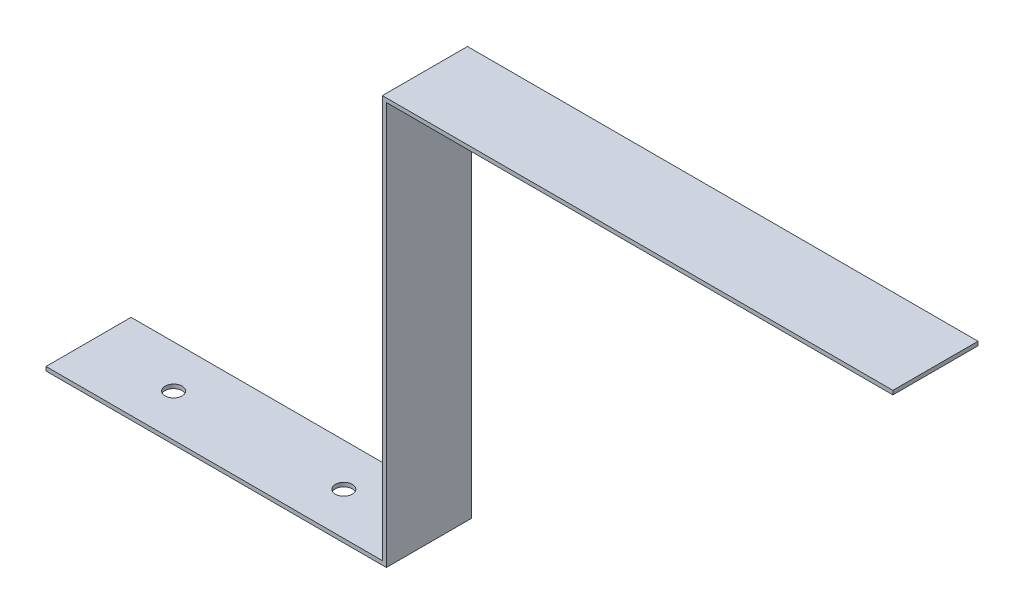
ISO-10303-21;
HEADER;
FILE_DESCRIPTION(('STEP AP214'),'2;1');
FILE_NAME('part.step','',(''),(''),'','','');
FILE_SCHEMA(('AUTOMOTIVE_DESIGN { 1 0 10303 214 1 1 1 1 }'));
ENDSEC;
DATA;
#1=APPLICATION_CONTEXT('core data for automotive mechanical design processes');
#2=APPLICATION_PROTOCOL_DEFINITION('international standard','automotive_design',2000,#1);
#3=PRODUCT_CONTEXT('',#1,'mechanical');
#4=PRODUCT('Part','Part','',(#3));
#5=PRODUCT_RELATED_PRODUCT_CATEGORY('part','',(#4));
#6=PRODUCT_DEFINITION_FORMATION('','',#4);
#7=PRODUCT_DEFINITION_CONTEXT('part definition',#1,'design');
#8=PRODUCT_DEFINITION('design','',#6,#7);
#9=PRODUCT_DEFINITION_SHAPE('','',#8);
#10=(LENGTH_UNIT() NAMED_UNIT(*) SI_UNIT(.MILLI.,.METRE.));
#11=(NAMED_UNIT(*) PLANE_ANGLE_UNIT() SI_UNIT($,.RADIAN.));
#12=(NAMED_UNIT(*) SI_UNIT($,.STERADIAN.) SOLID_ANGLE_UNIT());
#13=UNCERTAINTY_MEASURE_WITH_UNIT(LENGTH_MEASURE(1.E-05),#10,'distance_accuracy_value','');
#14=(GEOMETRIC_REPRESENTATION_CONTEXT(3) GLOBAL_UNCERTAINTY_ASSIGNED_CONTEXT((#13)) GLOBAL_UNIT_ASSIGNED_CONTEXT((#10,
#11,#12)) REPRESENTATION_CONTEXT('',''));
#15=CARTESIAN_POINT('',(0.,0.,0.));
#16=DIRECTION('',(0.,0.,1.));
#17=DIRECTION('',(1.,0.,0.));
#18=AXIS2_PLACEMENT_3D('',#15,#16,#17);
#19=CARTESIAN_POINT('',(0.,0.69999999999999,15.));
#20=DIRECTION('',(1.,0.,0.));
#21=DIRECTION('',(0.,1.,0.));
#22=AXIS2_PLACEMENT_3D('',#19,#20,#21);
#23=PLANE('',#22);
#24=DIRECTION('',(0.,-1.,0.));
#25=VECTOR('',#24,1.);
#26=CARTESIAN_POINT('',(0.,0.69999999999999,0.));
#27=LINE('',#26,#25);
#28=CARTESIAN_POINT('',(0.,0.69999999999999,0.));
#29=VERTEX_POINT('',#28);
#30=CARTESIAN_POINT('',(0.,0.,0.));
#31=VERTEX_POINT('',#30);
#32=EDGE_CURVE('E140',#29,#31,#27,.T.);
#33=ORIENTED_EDGE('',*,*,#32,.T.);
#34=DIRECTION('',(0.,0.,-1.));
#35=VECTOR('',#34,1.);
#36=CARTESIAN_POINT('',(0.,0.,15.));
#37=LINE('',#36,#35);
#38=CARTESIAN_POINT('',(0.,0.,15.));
#39=VERTEX_POINT('',#38);
#40=EDGE_CURVE('E11',#39,#31,#37,.T.);
#41=ORIENTED_EDGE('',*,*,#40,.F.);
#42=DIRECTION('',(0.,-1.,0.));
#43=VECTOR('',#42,1.);
#44=CARTESIAN_POINT('',(0.,0.69999999999999,15.));
#45=LINE('',#44,#43);
#46=CARTESIAN_POINT('',(0.,0.69999999999999,15.));
#47=VERTEX_POINT('',#46);
#48=EDGE_CURVE('E163',#47,#39,#45,.T.);
#49=ORIENTED_EDGE('',*,*,#48,.F.);
#50=DIRECTION('',(0.,0.,-1.));
#51=VECTOR('',#50,1.);
#52=CARTESIAN_POINT('',(0.,0.69999999999999,15.));
#53=LINE('',#52,#51);
#54=EDGE_CURVE('E136',#47,#29,#53,.T.);
#55=ORIENTED_EDGE('',*,*,#54,.T.);
#56=EDGE_LOOP('',(#33,#41,#49,#55));
#57=FACE_BOUND('',#56,.T.);
#58=ADVANCED_FACE('F39',(#57),#23,.F.);
#59=CARTESIAN_POINT('',(0.,0.,15.));
#60=DIRECTION('',(0.,1.,0.));
#61=DIRECTION('',(0.,0.,1.));
#62=AXIS2_PLACEMENT_3D('',#59,#60,#61);
#63=PLANE('',#62);
#64=CARTESIAN_POINT('',(15.,0.,7.5));
#65=DIRECTION('',(0.,1.,0.));
#66=DIRECTION('',(-1.,0.,0.));
#67=AXIS2_PLACEMENT_3D('',#64,#65,#66);
#68=CIRCLE('',#67,1.5);
#69=CARTESIAN_POINT('',(13.5,0.,7.5));
#70=VERTEX_POINT('',#69);
#71=EDGE_CURVE('E145',#70,#70,#68,.T.);
#72=ORIENTED_EDGE('',*,*,#71,.T.);
#73=EDGE_LOOP('',(#72));
#74=FACE_BOUND('',#73,.T.);
#75=CARTESIAN_POINT('',(45.,0.,7.5));
#76=DIRECTION('',(0.,1.,0.));
#77=DIRECTION('',(-1.,0.,0.));
#78=AXIS2_PLACEMENT_3D('',#75,#76,#77);
#79=CIRCLE('',#78,1.5);
#80=CARTESIAN_POINT('',(43.5,0.,7.5));
#81=VERTEX_POINT('',#80);
#82=EDGE_CURVE('E211',#81,#81,#79,.T.);
#83=ORIENTED_EDGE('',*,*,#82,.T.);
#84=EDGE_LOOP('',(#83));
#85=FACE_BOUND('',#84,.T.);
#86=DIRECTION('',(1.,0.,0.));
#87=VECTOR('',#86,1.);
#88=CARTESIAN_POINT('',(0.,0.,0.));
#89=LINE('',#88,#87);
#90=CARTESIAN_POINT('',(60.,0.,0.));
#91=VERTEX_POINT('',#90);
#92=EDGE_CURVE('E144',#31,#91,#89,.T.);
#93=ORIENTED_EDGE('',*,*,#92,.T.);
#94=DIRECTION('',(0.,0.,-1.));
#95=VECTOR('',#94,1.);
#96=CARTESIAN_POINT('',(60.,0.,15.));
#97=LINE('',#96,#95);
#98=CARTESIAN_POINT('',(60.,0.,15.));
#99=VERTEX_POINT('',#98);
#100=EDGE_CURVE('E48',#99,#91,#97,.T.);
#101=ORIENTED_EDGE('',*,*,#100,.F.);
#102=DIRECTION('',(1.,0.,0.));
#103=VECTOR('',#102,1.);
#104=CARTESIAN_POINT('',(0.,0.,15.));
#105=LINE('',#104,#103);
#106=EDGE_CURVE('E99',#39,#99,#105,.T.);
#107=ORIENTED_EDGE('',*,*,#106,.F.);
#108=ORIENTED_EDGE('',*,*,#40,.T.);
#109=EDGE_LOOP('',(#93,#101,#107,#108));
#110=FACE_BOUND('',#109,.T.);
#111=ADVANCED_FACE('F223',(#74,#85,#110),#63,.F.);
#112=CARTESIAN_POINT('',(60.,0.,15.));
#113=DIRECTION('',(-1.,0.,0.));
#114=DIRECTION('',(0.,0.,1.));
#115=AXIS2_PLACEMENT_3D('',#112,#113,#114);
#116=PLANE('',#115);
#117=DIRECTION('',(0.,1.,0.));
#118=VECTOR('',#117,1.);
#119=CARTESIAN_POINT('',(60.,0.,0.));
#120=LINE('',#119,#118);
#121=CARTESIAN_POINT('',(60.,71.,0.));
#122=VERTEX_POINT('',#121);
#123=EDGE_CURVE('E148',#91,#122,#120,.T.);
#124=ORIENTED_EDGE('',*,*,#123,.T.);
#125=DIRECTION('',(0.,0.,-1.));
#126=VECTOR('',#125,1.);
#127=CARTESIAN_POINT('',(60.,71.,15.));
#128=LINE('',#127,#126);
#129=CARTESIAN_POINT('',(60.,71.,15.));
#130=VERTEX_POINT('',#129);
#131=EDGE_CURVE('E174',#130,#122,#128,.T.);
#132=ORIENTED_EDGE('',*,*,#131,.F.);
#133=DIRECTION('',(0.,1.,0.));
#134=VECTOR('',#133,1.);
#135=CARTESIAN_POINT('',(60.,0.,15.));
#136=LINE('',#135,#134);
#137=EDGE_CURVE('E184',#99,#130,#136,.T.);
#138=ORIENTED_EDGE('',*,*,#137,.F.);
#139=ORIENTED_EDGE('',*,*,#100,.T.);
#140=EDGE_LOOP('',(#124,#132,#138,#139));
#141=FACE_BOUND('',#140,.T.);
#142=ADVANCED_FACE('F182',(#141),#116,.F.);
#143=CARTESIAN_POINT('',(60.,71.,15.));
#144=DIRECTION('',(0.,1.,0.));
#145=DIRECTION('',(0.,0.,1.));
#146=AXIS2_PLACEMENT_3D('',#143,#144,#145);
#147=PLANE('',#146);
#148=DIRECTION('',(1.,0.,0.));
#149=VECTOR('',#148,1.);
#150=CARTESIAN_POINT('',(60.,71.,0.));
#151=LINE('',#150,#149);
#152=CARTESIAN_POINT('',(149.3,71.,0.));
#153=VERTEX_POINT('',#152);
#154=EDGE_CURVE('E151',#122,#153,#151,.T.);
#155=ORIENTED_EDGE('',*,*,#154,.T.);
#156=DIRECTION('',(0.,0.,-1.));
#157=VECTOR('',#156,1.);
#158=CARTESIAN_POINT('',(149.3,71.,15.));
#159=LINE('',#158,#157);
#160=CARTESIAN_POINT('',(149.3,71.,15.));
#161=VERTEX_POINT('',#160);
#162=EDGE_CURVE('E170',#161,#153,#159,.T.);
#163=ORIENTED_EDGE('',*,*,#162,.F.);
#164=DIRECTION('',(1.,0.,0.));
#165=VECTOR('',#164,1.);
#166=CARTESIAN_POINT('',(60.,71.,15.));
#167=LINE('',#166,#165);
#168=EDGE_CURVE('E197',#130,#161,#167,.T.);
#169=ORIENTED_EDGE('',*,*,#168,.F.);
#170=ORIENTED_EDGE('',*,*,#131,.T.);
#171=EDGE_LOOP('',(#155,#163,#169,#170));
#172=FACE_BOUND('',#171,.T.);
#173=ADVANCED_FACE('F192',(#172),#147,.F.);
#174=CARTESIAN_POINT('',(149.3,71.,15.));
#175=DIRECTION('',(-1.,0.,0.));
#176=DIRECTION('',(0.,0.,1.));
#177=AXIS2_PLACEMENT_3D('',#174,#175,#176);
#178=PLANE('',#177);
#179=DIRECTION('',(0.,1.,0.));
#180=VECTOR('',#179,1.);
#181=CARTESIAN_POINT('',(149.3,71.,0.));
#182=LINE('',#181,#180);
#183=CARTESIAN_POINT('',(149.3,71.7,0.));
#184=VERTEX_POINT('',#183);
#185=EDGE_CURVE('E154',#153,#184,#182,.T.);
#186=ORIENTED_EDGE('',*,*,#185,.T.);
#187=DIRECTION('',(0.,0.,-1.));
#188=VECTOR('',#187,1.);
#189=CARTESIAN_POINT('',(149.3,71.7,15.));
#190=LINE('',#189,#188);
#191=CARTESIAN_POINT('',(149.3,71.7,15.));
#192=VERTEX_POINT('',#191);
#193=EDGE_CURVE('E129',#192,#184,#190,.T.);
#194=ORIENTED_EDGE('',*,*,#193,.F.);
#195=DIRECTION('',(0.,1.,0.));
#196=VECTOR('',#195,1.);
#197=CARTESIAN_POINT('',(149.3,71.,15.));
#198=LINE('',#197,#196);
#199=EDGE_CURVE('E118',#161,#192,#198,.T.);
#200=ORIENTED_EDGE('',*,*,#199,.F.);
#201=ORIENTED_EDGE('',*,*,#162,.T.);
#202=EDGE_LOOP('',(#186,#194,#200,#201));
#203=FACE_BOUND('',#202,.T.);
#204=ADVANCED_FACE('F195',(#203),#178,.F.);
#205=CARTESIAN_POINT('',(149.3,71.7,15.));
#206=DIRECTION('',(0.,-1.,0.));
#207=DIRECTION('',(1.,0.,0.));
#208=AXIS2_PLACEMENT_3D('',#205,#206,#207);
#209=PLANE('',#208);
#210=DIRECTION('',(-1.,0.,0.));
#211=VECTOR('',#210,1.);
#212=CARTESIAN_POINT('',(149.3,71.7,0.));
#213=LINE('',#212,#211);
#214=CARTESIAN_POINT('',(59.3,71.7,0.));
#215=VERTEX_POINT('',#214);
#216=EDGE_CURVE('E127',#184,#215,#213,.T.);
#217=ORIENTED_EDGE('',*,*,#216,.T.);
#218=DIRECTION('',(0.,0.,-1.));
#219=VECTOR('',#218,1.);
#220=CARTESIAN_POINT('',(59.3,71.7,15.));
#221=LINE('',#220,#219);
#222=CARTESIAN_POINT('',(59.3,71.7,15.));
#223=VERTEX_POINT('',#222);
#224=EDGE_CURVE('E124',#223,#215,#221,.T.);
#225=ORIENTED_EDGE('',*,*,#224,.F.);
#226=DIRECTION('',(-1.,0.,0.));
#227=VECTOR('',#226,1.);
#228=CARTESIAN_POINT('',(149.3,71.7,15.));
#229=LINE('',#228,#227);
#230=EDGE_CURVE('E112',#192,#223,#229,.T.);
#231=ORIENTED_EDGE('',*,*,#230,.F.);
#232=ORIENTED_EDGE('',*,*,#193,.T.);
#233=EDGE_LOOP('',(#217,#225,#231,#232));
#234=FACE_BOUND('',#233,.T.);
#235=ADVANCED_FACE('F125',(#234),#209,.F.);
#236=CARTESIAN_POINT('',(59.3,71.7,15.));
#237=DIRECTION('',(1.,0.,0.));
#238=DIRECTION('',(0.,1.,0.));
#239=AXIS2_PLACEMENT_3D('',#236,#237,#238);
#240=PLANE('',#239);
#241=DIRECTION('',(0.,-1.,0.));
#242=VECTOR('',#241,1.);
#243=CARTESIAN_POINT('',(59.3,71.7,0.));
#244=LINE('',#243,#242);
#245=CARTESIAN_POINT('',(59.3,0.700000000000006,0.));
#246=VERTEX_POINT('',#245);
#247=EDGE_CURVE('E85',#215,#246,#244,.T.);
#248=ORIENTED_EDGE('',*,*,#247,.T.);
#249=DIRECTION('',(0.,0.,-1.));
#250=VECTOR('',#249,1.);
#251=CARTESIAN_POINT('',(59.3,0.700000000000006,15.));
#252=LINE('',#251,#250);
#253=CARTESIAN_POINT('',(59.3,0.700000000000006,15.));
#254=VERTEX_POINT('',#253);
#255=EDGE_CURVE('E130',#254,#246,#252,.T.);
#256=ORIENTED_EDGE('',*,*,#255,.F.);
#257=DIRECTION('',(0.,-1.,0.));
#258=VECTOR('',#257,1.);
#259=CARTESIAN_POINT('',(59.3,71.7,15.));
#260=LINE('',#259,#258);
#261=EDGE_CURVE('E116',#223,#254,#260,.T.);
#262=ORIENTED_EDGE('',*,*,#261,.F.);
#263=ORIENTED_EDGE('',*,*,#224,.T.);
#264=EDGE_LOOP('',(#248,#256,#262,#263));
#265=FACE_BOUND('',#264,.T.);
#266=ADVANCED_FACE('F132',(#265),#240,.F.);
#267=CARTESIAN_POINT('',(59.3,0.700000000000006,15.));
#268=DIRECTION('',(0.,-1.,0.));
#269=DIRECTION('',(1.,0.,0.));
#270=AXIS2_PLACEMENT_3D('',#267,#268,#269);
#271=PLANE('',#270);
#272=CARTESIAN_POINT('',(15.,0.699999999999994,7.5));
#273=DIRECTION('',(0.,1.,0.));
#274=DIRECTION('',(-1.,0.,0.));
#275=AXIS2_PLACEMENT_3D('',#272,#273,#274);
#276=CIRCLE('',#275,1.5);
#277=CARTESIAN_POINT('',(13.5,0.699999999999993,7.5));
#278=VERTEX_POINT('',#277);
#279=EDGE_CURVE('E215',#278,#278,#276,.T.);
#280=ORIENTED_EDGE('',*,*,#279,.F.);
#281=EDGE_LOOP('',(#280));
#282=FACE_BOUND('',#281,.T.);
#283=CARTESIAN_POINT('',(45.,0.700000000000002,7.5));
#284=DIRECTION('',(0.,1.,0.));
#285=DIRECTION('',(-1.,0.,0.));
#286=AXIS2_PLACEMENT_3D('',#283,#284,#285);
#287=CIRCLE('',#286,1.5);
#288=CARTESIAN_POINT('',(43.5,0.700000000000002,7.5));
#289=VERTEX_POINT('',#288);
#290=EDGE_CURVE('E207',#289,#289,#287,.T.);
#291=ORIENTED_EDGE('',*,*,#290,.F.);
#292=EDGE_LOOP('',(#291));
#293=FACE_BOUND('',#292,.T.);
#294=DIRECTION('',(-1.,0.,0.));
#295=VECTOR('',#294,1.);
#296=CARTESIAN_POINT('',(59.3,0.700000000000006,0.));
#297=LINE('',#296,#295);
#298=EDGE_CURVE('E91',#246,#29,#297,.T.);
#299=ORIENTED_EDGE('',*,*,#298,.T.);
#300=ORIENTED_EDGE('',*,*,#54,.F.);
#301=DIRECTION('',(-1.,0.,0.));
#302=VECTOR('',#301,1.);
#303=CARTESIAN_POINT('',(59.3,0.700000000000006,15.));
#304=LINE('',#303,#302);
#305=EDGE_CURVE('E56',#254,#47,#304,.T.);
#306=ORIENTED_EDGE('',*,*,#305,.F.);
#307=ORIENTED_EDGE('',*,*,#255,.T.);
#308=EDGE_LOOP('',(#299,#300,#306,#307));
#309=FACE_BOUND('',#308,.T.);
#310=ADVANCED_FACE('F233',(#282,#293,#309),#271,.F.);
#311=CARTESIAN_POINT('',(0.,0.,15.));
#312=DIRECTION('',(0.,0.,1.));
#313=DIRECTION('',(1.,0.,0.));
#314=AXIS2_PLACEMENT_3D('',#311,#312,#313);
#315=PLANE('',#314);
#316=ORIENTED_EDGE('',*,*,#48,.T.);
#317=ORIENTED_EDGE('',*,*,#106,.T.);
#318=ORIENTED_EDGE('',*,*,#137,.T.);
#319=ORIENTED_EDGE('',*,*,#168,.T.);
#320=ORIENTED_EDGE('',*,*,#199,.T.);
#321=ORIENTED_EDGE('',*,*,#230,.T.);
#322=ORIENTED_EDGE('',*,*,#261,.T.);
#323=ORIENTED_EDGE('',*,*,#305,.T.);
#324=EDGE_LOOP('',(#316,#317,#318,#319,#320,#321,#322,#323));
#325=FACE_BOUND('',#324,.T.);
#326=ADVANCED_FACE('F114',(#325),#315,.T.);
#327=CARTESIAN_POINT('',(0.,0.,0.));
#328=DIRECTION('',(0.,0.,1.));
#329=DIRECTION('',(1.,0.,0.));
#330=AXIS2_PLACEMENT_3D('',#327,#328,#329);
#331=PLANE('',#330);
#332=ORIENTED_EDGE('',*,*,#32,.F.);
#333=ORIENTED_EDGE('',*,*,#298,.F.);
#334=ORIENTED_EDGE('',*,*,#247,.F.);
#335=ORIENTED_EDGE('',*,*,#216,.F.);
#336=ORIENTED_EDGE('',*,*,#185,.F.);
#337=ORIENTED_EDGE('',*,*,#154,.F.);
#338=ORIENTED_EDGE('',*,*,#123,.F.);
#339=ORIENTED_EDGE('',*,*,#92,.F.);
#340=EDGE_LOOP('',(#332,#333,#334,#335,#336,#337,#338,#339));
#341=FACE_BOUND('',#340,.T.);
#342=ADVANCED_FACE('F188',(#341),#331,.F.);
#343=CARTESIAN_POINT('',(45.,0.,7.5));
#344=DIRECTION('',(0.,1.,0.));
#345=DIRECTION('',(-1.,0.,0.));
#346=AXIS2_PLACEMENT_3D('',#343,#344,#345);
#347=CYLINDRICAL_SURFACE('',#346,1.5);
#348=ORIENTED_EDGE('',*,*,#82,.F.);
#349=EDGE_LOOP('',(#348));
#350=FACE_BOUND('',#349,.T.);
#351=ORIENTED_EDGE('',*,*,#290,.T.);
#352=EDGE_LOOP('',(#351));
#353=FACE_BOUND('',#352,.T.);
#354=ADVANCED_FACE('F229',(#350,#353),#347,.F.);
#355=CARTESIAN_POINT('',(15.,0.,7.5));
#356=DIRECTION('',(0.,1.,0.));
#357=DIRECTION('',(-1.,0.,0.));
#358=AXIS2_PLACEMENT_3D('',#355,#356,#357);
#359=CYLINDRICAL_SURFACE('',#358,1.5);
#360=ORIENTED_EDGE('',*,*,#71,.F.);
#361=EDGE_LOOP('',(#360));
#362=FACE_BOUND('',#361,.T.);
#363=ORIENTED_EDGE('',*,*,#279,.T.);
#364=EDGE_LOOP('',(#363));
#365=FACE_BOUND('',#364,.T.);
#366=ADVANCED_FACE('F226',(#362,#365),#359,.F.);
#367=CLOSED_SHELL('',(#58,#111,#142,#173,#204,#235,#266,#310,#326,#342,#354,#366));
#368=MANIFOLD_SOLID_BREP('B2',#367);
#369=ADVANCED_BREP_SHAPE_REPRESENTATION('',(#18,#368),#14);
#370=SHAPE_DEFINITION_REPRESENTATION(#9,#369);
ENDSEC;
END-ISO-10303-21;
